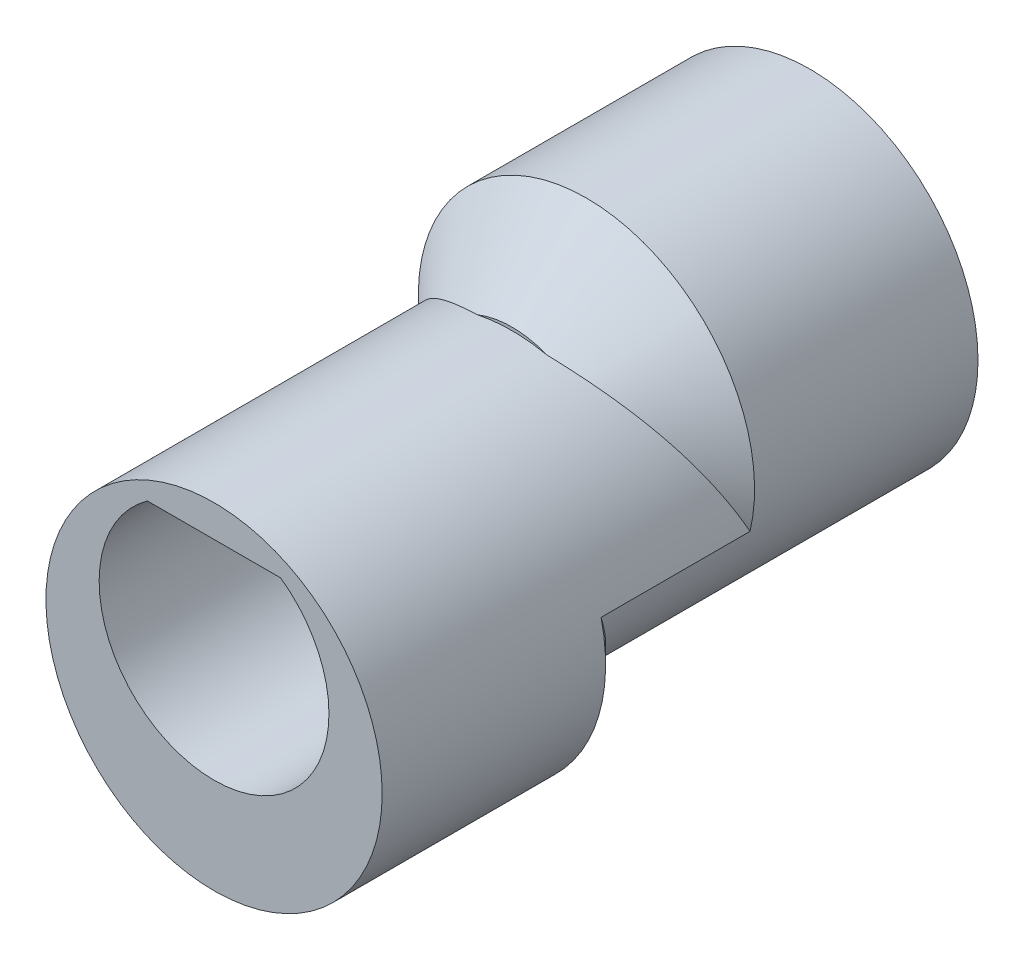
ISO-10303-21;
HEADER;
FILE_DESCRIPTION(('STEP AP214'),'2;1');
FILE_NAME('part.step','',(''),(''),'','','');
FILE_SCHEMA(('AUTOMOTIVE_DESIGN { 1 0 10303 214 1 1 1 1 }'));
ENDSEC;
DATA;
#1=APPLICATION_CONTEXT('core data for automotive mechanical design processes');
#2=APPLICATION_PROTOCOL_DEFINITION('international standard','automotive_design',2000,#1);
#3=PRODUCT_CONTEXT('',#1,'mechanical');
#4=PRODUCT('Part','Part','',(#3));
#5=PRODUCT_RELATED_PRODUCT_CATEGORY('part','',(#4));
#6=PRODUCT_DEFINITION_FORMATION('','',#4);
#7=PRODUCT_DEFINITION_CONTEXT('part definition',#1,'design');
#8=PRODUCT_DEFINITION('design','',#6,#7);
#9=PRODUCT_DEFINITION_SHAPE('','',#8);
#10=(LENGTH_UNIT() NAMED_UNIT(*) SI_UNIT(.MILLI.,.METRE.));
#11=(NAMED_UNIT(*) PLANE_ANGLE_UNIT() SI_UNIT($,.RADIAN.));
#12=(NAMED_UNIT(*) SI_UNIT($,.STERADIAN.) SOLID_ANGLE_UNIT());
#13=UNCERTAINTY_MEASURE_WITH_UNIT(LENGTH_MEASURE(1.E-05),#10,'distance_accuracy_value','');
#14=(GEOMETRIC_REPRESENTATION_CONTEXT(3) GLOBAL_UNCERTAINTY_ASSIGNED_CONTEXT((#13)) GLOBAL_UNIT_ASSIGNED_CONTEXT((#10,
#11,#12)) REPRESENTATION_CONTEXT('',''));
#15=CARTESIAN_POINT('',(0.,0.,0.));
#16=DIRECTION('',(0.,0.,1.));
#17=DIRECTION('',(1.,0.,0.));
#18=AXIS2_PLACEMENT_3D('',#15,#16,#17);
#19=CARTESIAN_POINT('',(0.,0.822072072072072,7.));
#20=DIRECTION('',(0.,0.,-1.));
#21=DIRECTION('',(-1.,0.,0.));
#22=AXIS2_PLACEMENT_3D('',#19,#20,#21);
#23=CYLINDRICAL_SURFACE('',#22,3.95);
#24=CARTESIAN_POINT('',(0.,0.822072072072072,7.));
#25=DIRECTION('',(0.,0.,1.));
#26=DIRECTION('',(1.,0.,0.));
#27=AXIS2_PLACEMENT_3D('',#24,#25,#26);
#28=CIRCLE('',#27,3.95);
#29=CARTESIAN_POINT('',(-0.817850044232283,-3.04233231995903,7.));
#30=VERTEX_POINT('',#29);
#31=CARTESIAN_POINT('',(0.817850044232283,-3.04233231995903,7.));
#32=VERTEX_POINT('',#31);
#33=EDGE_CURVE('E126',#30,#32,#28,.T.);
#34=ORIENTED_EDGE('',*,*,#33,.F.);
#35=CARTESIAN_POINT('',(-0.817850044232284,-3.04233231995903,7.));
#36=CARTESIAN_POINT('',(-0.912082582638536,-3.0223924852395,7.01651049900244));
#37=CARTESIAN_POINT('',(-1.00507197133809,-2.99910784635031,7.03561319296323));
#38=CARTESIAN_POINT('',(-1.18807390143181,-2.94622171986774,7.07831128281761));
#39=CARTESIAN_POINT('',(-1.27808949485708,-2.91662695671472,7.10190189326148));
#40=CARTESIAN_POINT('',(-1.54223198031981,-2.8192316380572,7.17814181924992));
#41=CARTESIAN_POINT('',(-1.71153413884567,-2.74258516675664,7.23646234309769));
#42=CARTESIAN_POINT('',(-2.04227882898572,-2.56445527612452,7.3662926797048));
#43=CARTESIAN_POINT('',(-2.2029818184253,-2.46197669206169,7.43829230832619));
#44=CARTESIAN_POINT('',(-2.50627736822124,-2.23681839039009,7.58947122317375));
#45=CARTESIAN_POINT('',(-2.6488307041962,-2.11409619335581,7.66866544618592));
#46=CARTESIAN_POINT('',(-2.94146233487049,-1.82388392597771,7.84791554108272));
#47=CARTESIAN_POINT('',(-3.08700773469803,-1.65238336517062,7.94890047611089));
#48=CARTESIAN_POINT('',(-3.34648402817079,-1.28824988998564,8.15299210206665));
#49=CARTESIAN_POINT('',(-3.46043500514819,-1.09563050918966,8.25609740017638));
#50=CARTESIAN_POINT('',(-3.6193832482977,-0.766305760925952,8.42470870122634));
#51=CARTESIAN_POINT('',(-3.67443451002463,-0.634442995210983,8.49038438528838));
#52=CARTESIAN_POINT('',(-3.76997644920464,-0.365414659297381,8.62090972014171));
#53=CARTESIAN_POINT('',(-3.81048820823831,-0.22825708876252,8.68576043432434));
#54=CARTESIAN_POINT('',(-3.84350274372788,-0.0889639639639634,8.75));
#55=B_SPLINE_CURVE_WITH_KNOTS('',3,(#35,#36,#37,#38,#39,#40,#41,#42,#43,#44,#45,#46,#47,#48,#49,
#50,#51,#52,#53,#54),.UNSPECIFIED.,.F.,.F.,(4,2,2,2,2,2,2,2,2,4),(0.,0.292942004280142,
0.585573378765179,1.16750707255859,1.7766973323255,2.38718257666698,3.1238281391609,
3.86000436586059,4.33108446072667,4.80147872594641),.UNSPECIFIED.);
#56=CARTESIAN_POINT('',(-3.84350274372788,-0.0889639639639638,8.75));
#57=VERTEX_POINT('',#56);
#58=EDGE_CURVE('E11',#30,#57,#55,.T.);
#59=ORIENTED_EDGE('',*,*,#58,.T.);
#60=DIRECTION('',(0.,0.,-1.));
#61=VECTOR('',#60,1.);
#62=CARTESIAN_POINT('',(-3.84350274372788,-0.0889639639639638,7.));
#63=LINE('',#62,#61);
#64=CARTESIAN_POINT('',(-3.84350274372788,-0.0889639639639638,5.24999999999999));
#65=VERTEX_POINT('',#64);
#66=EDGE_CURVE('E138',#57,#65,#63,.T.);
#67=ORIENTED_EDGE('',*,*,#66,.T.);
#68=CARTESIAN_POINT('',(0.,0.822072072072072,5.24999999999999));
#69=DIRECTION('',(0.,0.,1.));
#70=DIRECTION('',(1.,0.,0.));
#71=AXIS2_PLACEMENT_3D('',#68,#69,#70);
#72=CIRCLE('',#71,3.95);
#73=CARTESIAN_POINT('',(3.84350274372788,-0.0889639639639638,5.24999999999999));
#74=VERTEX_POINT('',#73);
#75=EDGE_CURVE('E135',#65,#74,#72,.F.);
#76=ORIENTED_EDGE('',*,*,#75,.T.);
#77=DIRECTION('',(0.,0.,-1.));
#78=VECTOR('',#77,1.);
#79=CARTESIAN_POINT('',(3.84350274372788,-0.0889639639639638,5.24999999999999));
#80=LINE('',#79,#78);
#81=CARTESIAN_POINT('',(3.84350274372788,-0.0889639639639638,8.75));
#82=VERTEX_POINT('',#81);
#83=EDGE_CURVE('E133',#74,#82,#80,.F.);
#84=ORIENTED_EDGE('',*,*,#83,.T.);
#85=CARTESIAN_POINT('',(3.84350274372788,-0.0889639639639638,8.75));
#86=CARTESIAN_POINT('',(3.81528769779431,-0.20797122697141,8.69510735005948));
#87=CARTESIAN_POINT('',(3.78161742052337,-0.325406206503519,8.63978680771635));
#88=CARTESIAN_POINT('',(3.70367041907941,-0.556408073284509,8.52855999596291));
#89=CARTESIAN_POINT('',(3.65939423951785,-0.669975158807256,8.47265375676896));
#90=CARTESIAN_POINT('',(3.5110404817319,-1.00395867488094,8.30437684903749));
#91=CARTESIAN_POINT('',(3.39147681532019,-1.21749378591338,8.19152326659151));
#92=CARTESIAN_POINT('',(3.11442796893997,-1.61979077842719,7.96803786349388));
#93=CARTESIAN_POINT('',(2.95690765466462,-1.8085294556744,7.85740820479857));
#94=CARTESIAN_POINT('',(2.60700994836441,-2.15560786504676,7.64301673621841));
#95=CARTESIAN_POINT('',(2.41464321116462,-2.31395685888512,7.53925284022612));
#96=CARTESIAN_POINT('',(2.12460170019812,-2.50936020798202,7.40455946929118));
#97=CARTESIAN_POINT('',(2.03988481876867,-2.56192181069743,7.36748258003037));
#98=CARTESIAN_POINT('',(1.86575297698397,-2.66095620959624,7.29620671982021));
#99=CARTESIAN_POINT('',(1.77633771639555,-2.70742861600672,7.26200793314992));
#100=CARTESIAN_POINT('',(1.59343136564689,-2.79368135750707,7.19732480125986));
#101=CARTESIAN_POINT('',(1.49995421738171,-2.83348260882192,7.16682893233663));
#102=CARTESIAN_POINT('',(1.30907370662775,-2.9060960302151,7.11025202259054));
#103=CARTESIAN_POINT('',(1.21167311590006,-2.93891303487362,7.08416793046654));
#104=CARTESIAN_POINT('',(1.06421775276788,-2.98219966458105,7.04928069187929));
#105=CARTESIAN_POINT('',(1.01545242094585,-2.99550890014833,7.03846704301152));
#106=CARTESIAN_POINT('',(0.91718664510798,-3.02030167100528,7.01819407300388));
#107=CARTESIAN_POINT('',(0.867686260218656,-3.03178535227918,7.00873464357707));
#108=CARTESIAN_POINT('',(0.817850044232287,-3.04233231995903,6.99999999999999));
#109=B_SPLINE_CURVE_WITH_KNOTS('',3,(#85,#86,#87,#88,#89,#90,#91,#92,#93,#94,#95,#96,#97,#98,
#99,#100,#101,#102,#103,#104,#105,#106,#107,#108),.UNSPECIFIED.,.F.,.F.,(4,2,2,2,2,2,2,2,2,2,2,
4),(0.,0.401917559158201,0.803814484333555,1.60815418667301,2.41324130000954,3.21808265993525,
3.53695551739659,3.85584877613042,4.17372269974228,4.49137586630428,4.64640565446899,
4.80142303911338),.UNSPECIFIED.);
#110=EDGE_CURVE('E50',#82,#32,#109,.T.);
#111=ORIENTED_EDGE('',*,*,#110,.T.);
#112=EDGE_LOOP('',(#34,#59,#67,#76,#84,#111));
#113=FACE_BOUND('',#112,.T.);
#114=CARTESIAN_POINT('',(0.,0.822072072072072,0.));
#115=DIRECTION('',(0.,0.,1.));
#116=DIRECTION('',(1.,0.,0.));
#117=AXIS2_PLACEMENT_3D('',#114,#115,#116);
#118=CIRCLE('',#117,3.95);
#119=CARTESIAN_POINT('',(3.95,0.822072072072072,0.));
#120=VERTEX_POINT('',#119);
#121=EDGE_CURVE('E123',#120,#120,#118,.T.);
#122=ORIENTED_EDGE('',*,*,#121,.T.);
#123=EDGE_LOOP('',(#122));
#124=FACE_BOUND('',#123,.T.);
#125=ADVANCED_FACE('F35',(#113,#124),#23,.T.);
#126=CARTESIAN_POINT('',(0.,0.822072072072072,7.));
#127=DIRECTION('',(0.,0.,1.));
#128=DIRECTION('',(1.,0.,0.));
#129=AXIS2_PLACEMENT_3D('',#126,#127,#128);
#130=PLANE('',#129);
#131=CARTESIAN_POINT('',(0.,-1.,7.));
#132=DIRECTION('',(0.,0.,1.));
#133=DIRECTION('',(1.,0.,0.));
#134=AXIS2_PLACEMENT_3D('',#131,#132,#133);
#135=CIRCLE('',#134,3.95);
#136=CARTESIAN_POINT('',(0.817850044232321,2.86440439203109,7.));
#137=VERTEX_POINT('',#136);
#138=CARTESIAN_POINT('',(-0.817850044232321,2.86440439203109,7.));
#139=VERTEX_POINT('',#138);
#140=EDGE_CURVE('E118',#137,#139,#135,.T.);
#141=ORIENTED_EDGE('',*,*,#140,.F.);
#142=CARTESIAN_POINT('',(0.,0.822072072072072,7.));
#143=DIRECTION('',(0.,0.,1.));
#144=DIRECTION('',(1.,0.,0.));
#145=AXIS2_PLACEMENT_3D('',#142,#143,#144);
#146=CIRCLE('',#145,2.2);
#147=EDGE_CURVE('E128',#137,#139,#146,.T.);
#148=ORIENTED_EDGE('',*,*,#147,.T.);
#149=EDGE_LOOP('',(#141,#148));
#150=FACE_BOUND('',#149,.T.);
#151=ADVANCED_FACE('F169',(#150),#130,.T.);
#152=CARTESIAN_POINT('',(0.,0.822072072072072,0.));
#153=DIRECTION('',(0.,0.,1.));
#154=DIRECTION('',(1.,0.,0.));
#155=AXIS2_PLACEMENT_3D('',#152,#153,#154);
#156=PLANE('',#155);
#157=DIRECTION('',(-1.,0.,0.));
#158=VECTOR('',#157,1.);
#159=CARTESIAN_POINT('',(-1.56524758424985,2.2,0.));
#160=LINE('',#159,#158);
#161=CARTESIAN_POINT('',(1.56524758424985,2.2,0.));
#162=VERTEX_POINT('',#161);
#163=CARTESIAN_POINT('',(-1.56524758424985,2.2,0.));
#164=VERTEX_POINT('',#163);
#165=EDGE_CURVE('E105',#162,#164,#160,.T.);
#166=ORIENTED_EDGE('',*,*,#165,.T.);
#167=CARTESIAN_POINT('',(0.,0.,0.));
#168=DIRECTION('',(0.,0.,1.));
#169=DIRECTION('',(1.,0.,0.));
#170=AXIS2_PLACEMENT_3D('',#167,#168,#169);
#171=CIRCLE('',#170,2.7);
#172=EDGE_CURVE('E97',#164,#162,#171,.T.);
#173=ORIENTED_EDGE('',*,*,#172,.T.);
#174=EDGE_LOOP('',(#166,#173));
#175=FACE_BOUND('',#174,.T.);
#176=ORIENTED_EDGE('',*,*,#121,.F.);
#177=EDGE_LOOP('',(#176));
#178=FACE_BOUND('',#177,.T.);
#179=ADVANCED_FACE('F111',(#175,#178),#156,.F.);
#180=CARTESIAN_POINT('',(0.,-1.,7.));
#181=DIRECTION('',(0.,0.,1.));
#182=DIRECTION('',(1.,0.,0.));
#183=AXIS2_PLACEMENT_3D('',#180,#181,#182);
#184=PLANE('',#183);
#185=ORIENTED_EDGE('',*,*,#33,.T.);
#186=CARTESIAN_POINT('',(0.,-1.,7.));
#187=DIRECTION('',(0.,0.,1.));
#188=DIRECTION('',(1.,0.,0.));
#189=AXIS2_PLACEMENT_3D('',#186,#187,#188);
#190=CIRCLE('',#189,2.19999999999999);
#191=EDGE_CURVE('E62',#32,#30,#190,.F.);
#192=ORIENTED_EDGE('',*,*,#191,.T.);
#193=EDGE_LOOP('',(#185,#192));
#194=FACE_BOUND('',#193,.T.);
#195=ADVANCED_FACE('F224',(#194),#184,.F.);
#196=CARTESIAN_POINT('',(0.,-1.,14.));
#197=DIRECTION('',(0.,0.,-1.));
#198=DIRECTION('',(-1.,0.,0.));
#199=AXIS2_PLACEMENT_3D('',#196,#197,#198);
#200=CYLINDRICAL_SURFACE('',#199,3.95);
#201=CARTESIAN_POINT('',(0.,-1.,14.));
#202=DIRECTION('',(0.,0.,1.));
#203=DIRECTION('',(1.,0.,0.));
#204=AXIS2_PLACEMENT_3D('',#201,#202,#203);
#205=CIRCLE('',#204,3.95);
#206=CARTESIAN_POINT('',(3.95,-1.,14.));
#207=VERTEX_POINT('',#206);
#208=EDGE_CURVE('E120',#207,#207,#205,.T.);
#209=ORIENTED_EDGE('',*,*,#208,.F.);
#210=EDGE_LOOP('',(#209));
#211=FACE_BOUND('',#210,.T.);
#212=CARTESIAN_POINT('',(0.,-1.,8.75));
#213=DIRECTION('',(0.,0.,1.));
#214=DIRECTION('',(1.,0.,0.));
#215=AXIS2_PLACEMENT_3D('',#212,#213,#214);
#216=CIRCLE('',#215,3.95);
#217=EDGE_CURVE('E176',#57,#82,#216,.T.);
#218=ORIENTED_EDGE('',*,*,#217,.T.);
#219=ORIENTED_EDGE('',*,*,#83,.F.);
#220=CARTESIAN_POINT('',(3.84350274372788,-0.0889639639639638,5.24999999999999));
#221=CARTESIAN_POINT('',(3.81528769779431,0.0300432990434815,5.30489264994051));
#222=CARTESIAN_POINT('',(3.78161742052337,0.147478278575591,5.36021319228365));
#223=CARTESIAN_POINT('',(3.70367041907941,0.378480145356582,5.47144000403709));
#224=CARTESIAN_POINT('',(3.65939423951785,0.492047230879329,5.52734624323104));
#225=CARTESIAN_POINT('',(3.5110404817319,0.826030746953017,5.69562315096251));
#226=CARTESIAN_POINT('',(3.39147681532019,1.03956585798545,5.80847673340849));
#227=CARTESIAN_POINT('',(3.11442796893997,1.44186285049926,6.03196213650612));
#228=CARTESIAN_POINT('',(2.95690765466462,1.63060152774648,6.14259179520143));
#229=CARTESIAN_POINT('',(2.60700994836441,1.97767993711884,6.35698326378159));
#230=CARTESIAN_POINT('',(2.41464321116462,2.13602893095719,6.46074715977389));
#231=CARTESIAN_POINT('',(2.12460170019812,2.33143228005409,6.59544053070883));
#232=CARTESIAN_POINT('',(2.03988481876867,2.3839938827695,6.63251741996964));
#233=CARTESIAN_POINT('',(1.86575297698397,2.48302828166832,6.7037932801798));
#234=CARTESIAN_POINT('',(1.77633771639554,2.5295006880788,6.73799206685009));
#235=CARTESIAN_POINT('',(1.59343136564688,2.61575342957915,6.80267519874015));
#236=CARTESIAN_POINT('',(1.49995421738171,2.65555468089399,6.83317106766337));
#237=CARTESIAN_POINT('',(1.30907370662774,2.72816810228718,6.88974797740946));
#238=CARTESIAN_POINT('',(1.21167311590006,2.7609851069457,6.91583206953347));
#239=CARTESIAN_POINT('',(1.06421775276788,2.80427173665313,6.95071930812072));
#240=CARTESIAN_POINT('',(1.01545242094586,2.8175809722204,6.96153295698848));
#241=CARTESIAN_POINT('',(0.917186645108003,2.84237374307735,6.98180592699612));
#242=CARTESIAN_POINT('',(0.867686260218687,2.85385742435124,6.99126535642293));
#243=CARTESIAN_POINT('',(0.817850044232326,2.86440439203109,7.00000000000001));
#244=B_SPLINE_CURVE_WITH_KNOTS('',3,(#220,#221,#222,#223,#224,#225,#226,#227,#228,#229,#230,
#231,#232,#233,#234,#235,#236,#237,#238,#239,#240,#241,#242,#243),.UNSPECIFIED.,.F.,.F.,(4,2,2,
2,2,2,2,2,2,2,2,4),(0.,0.401917559158203,0.803814484333557,1.60815418667302,2.41324130000954,
3.21808265993526,3.5369555173966,3.85584877613043,4.17372269974229,4.49137586630429,
4.64640565446898,4.80142303911335),.UNSPECIFIED.);
#245=EDGE_CURVE('E148',#74,#137,#244,.T.);
#246=ORIENTED_EDGE('',*,*,#245,.T.);
#247=ORIENTED_EDGE('',*,*,#140,.T.);
#248=CARTESIAN_POINT('',(-0.817850044232323,2.86440439203109,7.));
#249=CARTESIAN_POINT('',(-0.912082582638576,2.84446455731156,6.98348950099756));
#250=CARTESIAN_POINT('',(-1.00507197133813,2.82117991842238,6.96438680703677));
#251=CARTESIAN_POINT('',(-1.18807390143185,2.76829379193979,6.92168871718239));
#252=CARTESIAN_POINT('',(-1.27808949485712,2.73869902878678,6.89809810673851));
#253=CARTESIAN_POINT('',(-1.54223198031985,2.64130371012925,6.82185818075007));
#254=CARTESIAN_POINT('',(-1.71153413884571,2.56465723882869,6.7635376569023));
#255=CARTESIAN_POINT('',(-2.04227882898576,2.38652734819657,6.63370732029519));
#256=CARTESIAN_POINT('',(-2.20298181842534,2.28404876413373,6.56170769167379));
#257=CARTESIAN_POINT('',(-2.50627736822128,2.05889046246213,6.41052877682623));
#258=CARTESIAN_POINT('',(-2.64883070419624,1.93616826542785,6.33133455381406));
#259=CARTESIAN_POINT('',(-2.94146233487053,1.64595599804974,6.15208445891725));
#260=CARTESIAN_POINT('',(-3.08700773469806,1.47445543724265,6.05109952388909));
#261=CARTESIAN_POINT('',(-3.34648402817082,1.11032196205767,5.84700789793333));
#262=CARTESIAN_POINT('',(-3.46043500514822,0.91770258126168,5.74390259982359));
#263=CARTESIAN_POINT('',(-3.61938324829772,0.588377832997979,5.57529129877364));
#264=CARTESIAN_POINT('',(-3.67443451002464,0.456515067283019,5.5096156147116));
#265=CARTESIAN_POINT('',(-3.76997644920464,0.187486731369436,5.37909027985827));
#266=CARTESIAN_POINT('',(-3.81048820823831,0.0503291608345839,5.31423956567565));
#267=CARTESIAN_POINT('',(-3.84350274372788,-0.0889639639639644,5.24999999999999));
#268=B_SPLINE_CURVE_WITH_KNOTS('',3,(#248,#249,#250,#251,#252,#253,#254,#255,#256,#257,#258,
#259,#260,#261,#262,#263,#264,#265,#266,#267),.UNSPECIFIED.,.F.,.F.,(4,2,2,2,2,2,2,2,2,4),(0.,
0.292942004280144,0.585573378765183,1.1675070725586,1.77669733232552,2.387182576667,
3.12382813916092,3.86000436586062,4.33108446072667,4.80147872594637),.UNSPECIFIED.);
#269=EDGE_CURVE('E141',#139,#65,#268,.T.);
#270=ORIENTED_EDGE('',*,*,#269,.T.);
#271=ORIENTED_EDGE('',*,*,#66,.F.);
#272=EDGE_LOOP('',(#218,#219,#246,#247,#270,#271));
#273=FACE_BOUND('',#272,.T.);
#274=ADVANCED_FACE('F154',(#211,#273),#200,.T.);
#275=CARTESIAN_POINT('',(0.,-1.,14.));
#276=DIRECTION('',(0.,0.,1.));
#277=DIRECTION('',(1.,0.,0.));
#278=AXIS2_PLACEMENT_3D('',#275,#276,#277);
#279=PLANE('',#278);
#280=CARTESIAN_POINT('',(0.,0.,14.));
#281=DIRECTION('',(0.,0.,1.));
#282=DIRECTION('',(1.,0.,0.));
#283=AXIS2_PLACEMENT_3D('',#280,#281,#282);
#284=CIRCLE('',#283,2.7);
#285=CARTESIAN_POINT('',(-1.56524758424985,2.2,14.));
#286=VERTEX_POINT('',#285);
#287=CARTESIAN_POINT('',(1.56524758424985,2.2,14.));
#288=VERTEX_POINT('',#287);
#289=EDGE_CURVE('E100',#286,#288,#284,.T.);
#290=ORIENTED_EDGE('',*,*,#289,.F.);
#291=DIRECTION('',(-1.,0.,0.));
#292=VECTOR('',#291,1.);
#293=CARTESIAN_POINT('',(-1.56524758424985,2.2,14.));
#294=LINE('',#293,#292);
#295=EDGE_CURVE('E113',#288,#286,#294,.T.);
#296=ORIENTED_EDGE('',*,*,#295,.F.);
#297=EDGE_LOOP('',(#290,#296));
#298=FACE_BOUND('',#297,.T.);
#299=ORIENTED_EDGE('',*,*,#208,.T.);
#300=EDGE_LOOP('',(#299));
#301=FACE_BOUND('',#300,.T.);
#302=ADVANCED_FACE('F210',(#298,#301),#279,.T.);
#303=CARTESIAN_POINT('',(0.,0.,0.));
#304=DIRECTION('',(0.,0.,1.));
#305=DIRECTION('',(1.,0.,0.));
#306=AXIS2_PLACEMENT_3D('',#303,#304,#305);
#307=CYLINDRICAL_SURFACE('',#306,2.7);
#308=ORIENTED_EDGE('',*,*,#289,.T.);
#309=DIRECTION('',(0.,0.,1.));
#310=VECTOR('',#309,1.);
#311=CARTESIAN_POINT('',(1.56524758424985,2.2,0.));
#312=LINE('',#311,#310);
#313=EDGE_CURVE('E93',#162,#288,#312,.T.);
#314=ORIENTED_EDGE('',*,*,#313,.F.);
#315=ORIENTED_EDGE('',*,*,#172,.F.);
#316=DIRECTION('',(0.,0.,1.));
#317=VECTOR('',#316,1.);
#318=CARTESIAN_POINT('',(-1.56524758424985,2.2,0.));
#319=LINE('',#318,#317);
#320=EDGE_CURVE('E104',#164,#286,#319,.T.);
#321=ORIENTED_EDGE('',*,*,#320,.T.);
#322=EDGE_LOOP('',(#308,#314,#315,#321));
#323=FACE_BOUND('',#322,.T.);
#324=ADVANCED_FACE('F95',(#323),#307,.F.);
#325=CARTESIAN_POINT('',(-1.56524758424985,2.2,0.));
#326=DIRECTION('',(0.,1.,0.));
#327=DIRECTION('',(0.,0.,1.));
#328=AXIS2_PLACEMENT_3D('',#325,#326,#327);
#329=PLANE('',#328);
#330=ORIENTED_EDGE('',*,*,#295,.T.);
#331=ORIENTED_EDGE('',*,*,#320,.F.);
#332=ORIENTED_EDGE('',*,*,#165,.F.);
#333=ORIENTED_EDGE('',*,*,#313,.T.);
#334=EDGE_LOOP('',(#330,#331,#332,#333));
#335=FACE_BOUND('',#334,.T.);
#336=ADVANCED_FACE('F108',(#335),#329,.F.);
#337=CARTESIAN_POINT('',(0.,0.822072072072072,7.));
#338=DIRECTION('',(0.,0.,-1.));
#339=DIRECTION('',(-1.,0.,0.));
#340=AXIS2_PLACEMENT_3D('',#337,#338,#339);
#341=CONICAL_SURFACE('',#340,2.2,0.785398163397446);
#342=ORIENTED_EDGE('',*,*,#245,.F.);
#343=ORIENTED_EDGE('',*,*,#75,.F.);
#344=ORIENTED_EDGE('',*,*,#269,.F.);
#345=ORIENTED_EDGE('',*,*,#147,.F.);
#346=EDGE_LOOP('',(#342,#343,#344,#345));
#347=FACE_BOUND('',#346,.T.);
#348=ADVANCED_FACE('F159',(#347),#341,.T.);
#349=CARTESIAN_POINT('',(0.,-1.,8.75));
#350=DIRECTION('',(0.,0.,1.));
#351=DIRECTION('',(1.,0.,0.));
#352=AXIS2_PLACEMENT_3D('',#349,#350,#351);
#353=CONICAL_SURFACE('',#352,3.95,0.78539816339745);
#354=ORIENTED_EDGE('',*,*,#58,.F.);
#355=ORIENTED_EDGE('',*,*,#191,.F.);
#356=ORIENTED_EDGE('',*,*,#110,.F.);
#357=ORIENTED_EDGE('',*,*,#217,.F.);
#358=EDGE_LOOP('',(#354,#355,#356,#357));
#359=FACE_BOUND('',#358,.T.);
#360=ADVANCED_FACE('F38',(#359),#353,.T.);
#361=CLOSED_SHELL('',(#125,#151,#179,#195,#274,#302,#324,#336,#348,#360));
#362=MANIFOLD_SOLID_BREP('B2',#361);
#363=ADVANCED_BREP_SHAPE_REPRESENTATION('',(#18,#362),#14);
#364=SHAPE_DEFINITION_REPRESENTATION(#9,#363);
ENDSEC;
END-ISO-10303-21;
